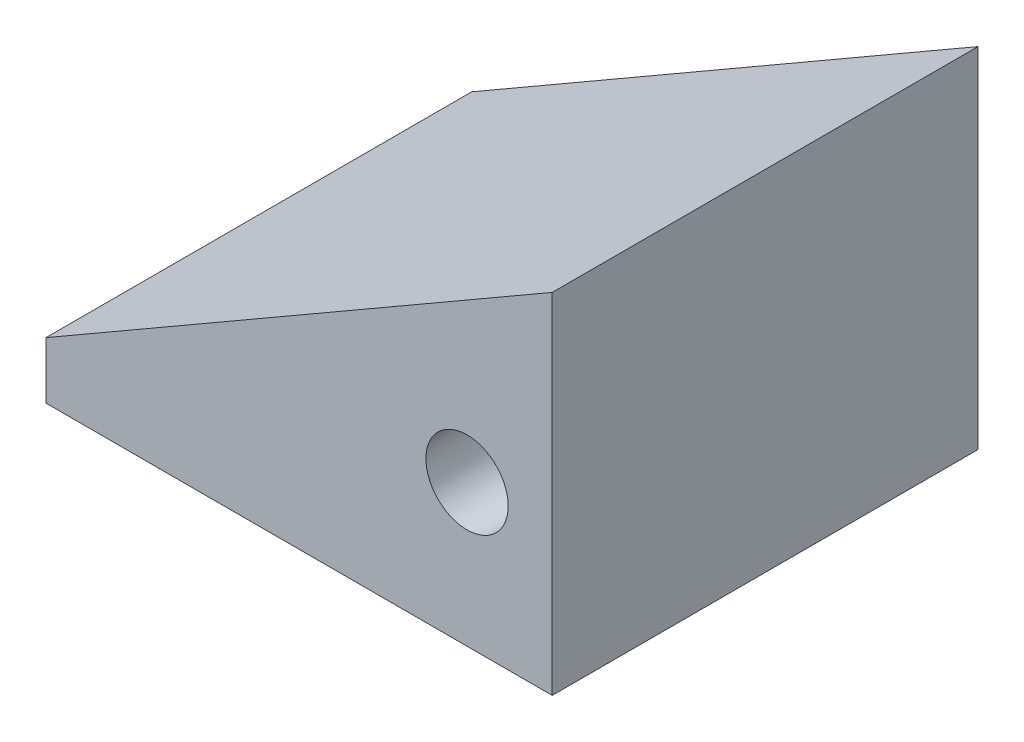
ISO-10303-21;
HEADER;
FILE_DESCRIPTION(('STEP AP214'),'2;1');
FILE_NAME('part.step','',(''),(''),'','','');
FILE_SCHEMA(('AUTOMOTIVE_DESIGN { 1 0 10303 214 1 1 1 1 }'));
ENDSEC;
DATA;
#1=APPLICATION_CONTEXT('core data for automotive mechanical design processes');
#2=APPLICATION_PROTOCOL_DEFINITION('international standard','automotive_design',2000,#1);
#3=PRODUCT_CONTEXT('',#1,'mechanical');
#4=PRODUCT('Part','Part','',(#3));
#5=PRODUCT_RELATED_PRODUCT_CATEGORY('part','',(#4));
#6=PRODUCT_DEFINITION_FORMATION('','',#4);
#7=PRODUCT_DEFINITION_CONTEXT('part definition',#1,'design');
#8=PRODUCT_DEFINITION('design','',#6,#7);
#9=PRODUCT_DEFINITION_SHAPE('','',#8);
#10=(LENGTH_UNIT() NAMED_UNIT(*) SI_UNIT(.MILLI.,.METRE.));
#11=(NAMED_UNIT(*) PLANE_ANGLE_UNIT() SI_UNIT($,.RADIAN.));
#12=(NAMED_UNIT(*) SI_UNIT($,.STERADIAN.) SOLID_ANGLE_UNIT());
#13=UNCERTAINTY_MEASURE_WITH_UNIT(LENGTH_MEASURE(1.E-05),#10,'distance_accuracy_value','');
#14=(GEOMETRIC_REPRESENTATION_CONTEXT(3) GLOBAL_UNCERTAINTY_ASSIGNED_CONTEXT((#13)) GLOBAL_UNIT_ASSIGNED_CONTEXT((#10,
#11,#12)) REPRESENTATION_CONTEXT('',''));
#15=CARTESIAN_POINT('',(0.,0.,0.));
#16=DIRECTION('',(0.,0.,1.));
#17=DIRECTION('',(1.,0.,0.));
#18=AXIS2_PLACEMENT_3D('',#15,#16,#17);
#19=CARTESIAN_POINT('',(0.,0.,15.));
#20=DIRECTION('',(1.,0.,0.));
#21=DIRECTION('',(0.,1.,0.));
#22=AXIS2_PLACEMENT_3D('',#19,#20,#21);
#23=PLANE('',#22);
#24=DIRECTION('',(0.,-1.,0.));
#25=VECTOR('',#24,1.);
#26=CARTESIAN_POINT('',(0.,0.,0.));
#27=LINE('',#26,#25);
#28=CARTESIAN_POINT('',(0.,0.,0.));
#29=VERTEX_POINT('',#28);
#30=CARTESIAN_POINT('',(0.,-2.,0.));
#31=VERTEX_POINT('',#30);
#32=EDGE_CURVE('E97',#29,#31,#27,.T.);
#33=ORIENTED_EDGE('',*,*,#32,.T.);
#34=DIRECTION('',(0.,0.,-1.));
#35=VECTOR('',#34,1.);
#36=CARTESIAN_POINT('',(0.,-2.,15.));
#37=LINE('',#36,#35);
#38=CARTESIAN_POINT('',(0.,-2.,15.));
#39=VERTEX_POINT('',#38);
#40=EDGE_CURVE('E11',#39,#31,#37,.T.);
#41=ORIENTED_EDGE('',*,*,#40,.F.);
#42=DIRECTION('',(0.,-1.,0.));
#43=VECTOR('',#42,1.);
#44=CARTESIAN_POINT('',(0.,0.,15.));
#45=LINE('',#44,#43);
#46=CARTESIAN_POINT('',(0.,0.,15.));
#47=VERTEX_POINT('',#46);
#48=EDGE_CURVE('E84',#47,#39,#45,.T.);
#49=ORIENTED_EDGE('',*,*,#48,.F.);
#50=DIRECTION('',(0.,0.,-1.));
#51=VECTOR('',#50,1.);
#52=CARTESIAN_POINT('',(0.,0.,15.));
#53=LINE('',#52,#51);
#54=EDGE_CURVE('E93',#47,#29,#53,.T.);
#55=ORIENTED_EDGE('',*,*,#54,.T.);
#56=EDGE_LOOP('',(#33,#41,#49,#55));
#57=FACE_BOUND('',#56,.T.);
#58=ADVANCED_FACE('F34',(#57),#23,.F.);
#59=CARTESIAN_POINT('',(0.,-2.,15.));
#60=DIRECTION('',(0.,1.,0.));
#61=DIRECTION('',(0.,0.,1.));
#62=AXIS2_PLACEMENT_3D('',#59,#60,#61);
#63=PLANE('',#62);
#64=DIRECTION('',(1.,0.,0.));
#65=VECTOR('',#64,1.);
#66=CARTESIAN_POINT('',(0.,-2.,0.));
#67=LINE('',#66,#65);
#68=CARTESIAN_POINT('',(17.832554500127,-2.,0.));
#69=VERTEX_POINT('',#68);
#70=EDGE_CURVE('E89',#31,#69,#67,.T.);
#71=ORIENTED_EDGE('',*,*,#70,.T.);
#72=DIRECTION('',(0.,0.,-1.));
#73=VECTOR('',#72,1.);
#74=CARTESIAN_POINT('',(17.832554500127,-2.,15.));
#75=LINE('',#74,#73);
#76=CARTESIAN_POINT('',(17.832554500127,-2.,15.));
#77=VERTEX_POINT('',#76);
#78=EDGE_CURVE('E42',#77,#69,#75,.T.);
#79=ORIENTED_EDGE('',*,*,#78,.F.);
#80=DIRECTION('',(1.,0.,0.));
#81=VECTOR('',#80,1.);
#82=CARTESIAN_POINT('',(0.,-2.,15.));
#83=LINE('',#82,#81);
#84=EDGE_CURVE('E79',#39,#77,#83,.T.);
#85=ORIENTED_EDGE('',*,*,#84,.F.);
#86=ORIENTED_EDGE('',*,*,#40,.T.);
#87=EDGE_LOOP('',(#71,#79,#85,#86));
#88=FACE_BOUND('',#87,.T.);
#89=ADVANCED_FACE('F88',(#88),#63,.F.);
#90=CARTESIAN_POINT('',(17.832554500127,0.295630140987024,15.));
#91=DIRECTION('',(-1.,0.,0.));
#92=DIRECTION('',(0.,-1.,0.));
#93=AXIS2_PLACEMENT_3D('',#90,#91,#92);
#94=PLANE('',#93);
#95=DIRECTION('',(0.,1.,0.));
#96=VECTOR('',#95,1.);
#97=CARTESIAN_POINT('',(17.832554500127,0.295630140987024,0.));
#98=LINE('',#97,#96);
#99=CARTESIAN_POINT('',(17.832554500127,10.295630140987,0.));
#100=VERTEX_POINT('',#99);
#101=EDGE_CURVE('E66',#69,#100,#98,.T.);
#102=ORIENTED_EDGE('',*,*,#101,.T.);
#103=DIRECTION('',(0.,0.,-1.));
#104=VECTOR('',#103,1.);
#105=CARTESIAN_POINT('',(17.832554500127,10.295630140987,15.));
#106=LINE('',#105,#104);
#107=CARTESIAN_POINT('',(17.832554500127,10.295630140987,15.));
#108=VERTEX_POINT('',#107);
#109=EDGE_CURVE('E90',#108,#100,#106,.T.);
#110=ORIENTED_EDGE('',*,*,#109,.F.);
#111=DIRECTION('',(0.,1.,0.));
#112=VECTOR('',#111,1.);
#113=CARTESIAN_POINT('',(17.832554500127,-2.,15.));
#114=LINE('',#113,#112);
#115=EDGE_CURVE('E82',#77,#108,#114,.T.);
#116=ORIENTED_EDGE('',*,*,#115,.F.);
#117=ORIENTED_EDGE('',*,*,#78,.T.);
#118=EDGE_LOOP('',(#102,#110,#116,#117));
#119=FACE_BOUND('',#118,.T.);
#120=ADVANCED_FACE('F91',(#119),#94,.F.);
#121=CARTESIAN_POINT('',(0.,0.,15.));
#122=DIRECTION('',(0.500000000000001,-0.866025403784438,0.));
#123=DIRECTION('',(0.866025403784438,0.500000000000001,0.));
#124=AXIS2_PLACEMENT_3D('',#121,#122,#123);
#125=PLANE('',#124);
#126=DIRECTION('',(-0.866025403784438,-0.500000000000001,0.));
#127=VECTOR('',#126,1.);
#128=CARTESIAN_POINT('',(0.,0.,0.));
#129=LINE('',#128,#127);
#130=EDGE_CURVE('E72',#100,#29,#129,.T.);
#131=ORIENTED_EDGE('',*,*,#130,.T.);
#132=ORIENTED_EDGE('',*,*,#54,.F.);
#133=DIRECTION('',(-0.866025403784438,-0.500000000000001,0.));
#134=VECTOR('',#133,1.);
#135=CARTESIAN_POINT('',(0.,0.,15.));
#136=LINE('',#135,#134);
#137=EDGE_CURVE('E50',#108,#47,#136,.T.);
#138=ORIENTED_EDGE('',*,*,#137,.F.);
#139=ORIENTED_EDGE('',*,*,#109,.T.);
#140=EDGE_LOOP('',(#131,#132,#138,#139));
#141=FACE_BOUND('',#140,.T.);
#142=ADVANCED_FACE('F105',(#141),#125,.F.);
#143=CARTESIAN_POINT('',(0.,0.,15.));
#144=DIRECTION('',(0.,0.,1.));
#145=DIRECTION('',(1.,0.,0.));
#146=AXIS2_PLACEMENT_3D('',#143,#144,#145);
#147=PLANE('',#146);
#148=CARTESIAN_POINT('',(14.832554500127,3.,15.));
#149=DIRECTION('',(0.,0.,1.));
#150=DIRECTION('',(1.,0.,0.));
#151=AXIS2_PLACEMENT_3D('',#148,#149,#150);
#152=CIRCLE('',#151,1.45);
#153=CARTESIAN_POINT('',(16.282554500127,3.,15.));
#154=VERTEX_POINT('',#153);
#155=EDGE_CURVE('E100',#154,#154,#152,.T.);
#156=ORIENTED_EDGE('',*,*,#155,.F.);
#157=EDGE_LOOP('',(#156));
#158=FACE_BOUND('',#157,.T.);
#159=ORIENTED_EDGE('',*,*,#48,.T.);
#160=ORIENTED_EDGE('',*,*,#84,.T.);
#161=ORIENTED_EDGE('',*,*,#115,.T.);
#162=ORIENTED_EDGE('',*,*,#137,.T.);
#163=EDGE_LOOP('',(#159,#160,#161,#162));
#164=FACE_BOUND('',#163,.T.);
#165=ADVANCED_FACE('F80',(#158,#164),#147,.T.);
#166=CARTESIAN_POINT('',(0.,0.,0.));
#167=DIRECTION('',(0.,0.,1.));
#168=DIRECTION('',(1.,0.,0.));
#169=AXIS2_PLACEMENT_3D('',#166,#167,#168);
#170=PLANE('',#169);
#171=CARTESIAN_POINT('',(14.832554500127,3.,0.));
#172=DIRECTION('',(0.,0.,1.));
#173=DIRECTION('',(1.,0.,0.));
#174=AXIS2_PLACEMENT_3D('',#171,#172,#173);
#175=CIRCLE('',#174,1.45);
#176=CARTESIAN_POINT('',(16.282554500127,3.,0.));
#177=VERTEX_POINT('',#176);
#178=EDGE_CURVE('E113',#177,#177,#175,.T.);
#179=ORIENTED_EDGE('',*,*,#178,.T.);
#180=EDGE_LOOP('',(#179));
#181=FACE_BOUND('',#180,.T.);
#182=ORIENTED_EDGE('',*,*,#32,.F.);
#183=ORIENTED_EDGE('',*,*,#130,.F.);
#184=ORIENTED_EDGE('',*,*,#101,.F.);
#185=ORIENTED_EDGE('',*,*,#70,.F.);
#186=EDGE_LOOP('',(#182,#183,#184,#185));
#187=FACE_BOUND('',#186,.T.);
#188=ADVANCED_FACE('F108',(#181,#187),#170,.F.);
#189=CARTESIAN_POINT('',(14.832554500127,3.,0.));
#190=DIRECTION('',(0.,0.,1.));
#191=DIRECTION('',(1.,0.,0.));
#192=AXIS2_PLACEMENT_3D('',#189,#190,#191);
#193=CYLINDRICAL_SURFACE('',#192,1.45);
#194=ORIENTED_EDGE('',*,*,#155,.T.);
#195=EDGE_LOOP('',(#194));
#196=FACE_BOUND('',#195,.T.);
#197=ORIENTED_EDGE('',*,*,#178,.F.);
#198=EDGE_LOOP('',(#197));
#199=FACE_BOUND('',#198,.T.);
#200=ADVANCED_FACE('F118',(#196,#199),#193,.F.);
#201=CLOSED_SHELL('',(#58,#89,#120,#142,#165,#188,#200));
#202=MANIFOLD_SOLID_BREP('B2',#201);
#203=ADVANCED_BREP_SHAPE_REPRESENTATION('',(#18,#202),#14);
#204=SHAPE_DEFINITION_REPRESENTATION(#9,#203);
ENDSEC;
END-ISO-10303-21;
